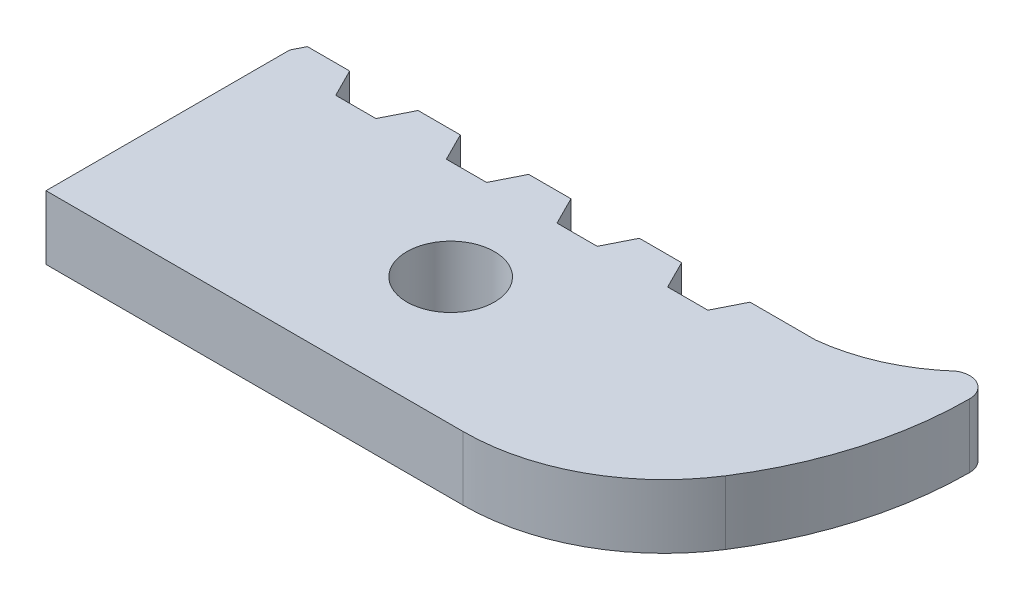
ISO-10303-21;
HEADER;
FILE_DESCRIPTION(('STEP AP214'),'2;1');
FILE_NAME('part.step','',(''),(''),'','','');
FILE_SCHEMA(('AUTOMOTIVE_DESIGN { 1 0 10303 214 1 1 1 1 }'));
ENDSEC;
DATA;
#1=APPLICATION_CONTEXT('core data for automotive mechanical design processes');
#2=APPLICATION_PROTOCOL_DEFINITION('international standard','automotive_design',2000,#1);
#3=PRODUCT_CONTEXT('',#1,'mechanical');
#4=PRODUCT('Part','Part','',(#3));
#5=PRODUCT_RELATED_PRODUCT_CATEGORY('part','',(#4));
#6=PRODUCT_DEFINITION_FORMATION('','',#4);
#7=PRODUCT_DEFINITION_CONTEXT('part definition',#1,'design');
#8=PRODUCT_DEFINITION('design','',#6,#7);
#9=PRODUCT_DEFINITION_SHAPE('','',#8);
#10=(LENGTH_UNIT() NAMED_UNIT(*) SI_UNIT(.MILLI.,.METRE.));
#11=(NAMED_UNIT(*) PLANE_ANGLE_UNIT() SI_UNIT($,.RADIAN.));
#12=(NAMED_UNIT(*) SI_UNIT($,.STERADIAN.) SOLID_ANGLE_UNIT());
#13=UNCERTAINTY_MEASURE_WITH_UNIT(LENGTH_MEASURE(1.E-05),#10,'distance_accuracy_value','');
#14=(GEOMETRIC_REPRESENTATION_CONTEXT(3) GLOBAL_UNCERTAINTY_ASSIGNED_CONTEXT((#13)) GLOBAL_UNIT_ASSIGNED_CONTEXT((#10,
#11,#12)) REPRESENTATION_CONTEXT('',''));
#15=CARTESIAN_POINT('',(0.,0.,0.));
#16=DIRECTION('',(0.,0.,1.));
#17=DIRECTION('',(1.,0.,0.));
#18=AXIS2_PLACEMENT_3D('',#15,#16,#17);
#19=CARTESIAN_POINT('',(-62.8446619217082,3.175,-8.70017793594306));
#20=DIRECTION('',(0.,0.,1.));
#21=DIRECTION('',(1.,0.,0.));
#22=AXIS2_PLACEMENT_3D('',#19,#20,#21);
#23=PLANE('',#22);
#24=DIRECTION('',(-1.,0.,0.));
#25=VECTOR('',#24,1.);
#26=CARTESIAN_POINT('',(-62.8446619217082,0.,-8.70017793594306));
#27=LINE('',#26,#25);
#28=CARTESIAN_POINT('',(-4.31466192170818,0.,-8.70017793594306));
#29=VERTEX_POINT('',#28);
#30=CARTESIAN_POINT('',(-6.41466192170818,0.,-8.70017793594306));
#31=VERTEX_POINT('',#30);
#32=EDGE_CURVE('E321',#29,#31,#27,.T.);
#33=ORIENTED_EDGE('',*,*,#32,.T.);
#34=DIRECTION('',(0.,1.,0.));
#35=VECTOR('',#34,1.);
#36=CARTESIAN_POINT('',(-6.41466192170818,-6.825,-8.70017793594306));
#37=LINE('',#36,#35);
#38=CARTESIAN_POINT('',(-6.41466192170818,3.175,-8.70017793594306));
#39=VERTEX_POINT('',#38);
#40=EDGE_CURVE('E328',#31,#39,#37,.T.);
#41=ORIENTED_EDGE('',*,*,#40,.T.);
#42=DIRECTION('',(-1.,0.,0.));
#43=VECTOR('',#42,1.);
#44=CARTESIAN_POINT('',(-62.8446619217082,3.175,-8.70017793594306));
#45=LINE('',#44,#43);
#46=CARTESIAN_POINT('',(-4.31466192170818,3.175,-8.70017793594306));
#47=VERTEX_POINT('',#46);
#48=EDGE_CURVE('E231',#47,#39,#45,.T.);
#49=ORIENTED_EDGE('',*,*,#48,.F.);
#50=DIRECTION('',(0.,1.,0.));
#51=VECTOR('',#50,1.);
#52=CARTESIAN_POINT('',(-4.31466192170818,-6.825,-8.70017793594306));
#53=LINE('',#52,#51);
#54=EDGE_CURVE('E330',#29,#47,#53,.T.);
#55=ORIENTED_EDGE('',*,*,#54,.F.);
#56=EDGE_LOOP('',(#33,#41,#49,#55));
#57=FACE_BOUND('',#56,.T.);
#58=ADVANCED_FACE('F42',(#57),#23,.F.);
#59=CARTESIAN_POINT('',(1.18533807829182,3.175,-8.70017793594306));
#60=VERTEX_POINT('',#59);
#61=CARTESIAN_POINT('',(-0.914661921708177,3.175,-8.70017793594306));
#62=VERTEX_POINT('',#61);
#63=EDGE_CURVE('E511',#60,#62,#45,.T.);
#64=ORIENTED_EDGE('',*,*,#63,.F.);
#65=DIRECTION('',(0.,1.,0.));
#66=VECTOR('',#65,1.);
#67=CARTESIAN_POINT('',(1.18533807829182,-6.825,-8.70017793594306));
#68=LINE('',#67,#66);
#69=CARTESIAN_POINT('',(1.18533807829182,0.,-8.70017793594306));
#70=VERTEX_POINT('',#69);
#71=EDGE_CURVE('E389',#70,#60,#68,.T.);
#72=ORIENTED_EDGE('',*,*,#71,.F.);
#73=CARTESIAN_POINT('',(-0.914661921708177,0.,-8.70017793594306));
#74=VERTEX_POINT('',#73);
#75=EDGE_CURVE('E332',#70,#74,#27,.T.);
#76=ORIENTED_EDGE('',*,*,#75,.T.);
#77=DIRECTION('',(0.,1.,0.));
#78=VECTOR('',#77,1.);
#79=CARTESIAN_POINT('',(-0.914661921708177,-6.825,-8.70017793594306));
#80=LINE('',#79,#78);
#81=EDGE_CURVE('E415',#74,#62,#80,.T.);
#82=ORIENTED_EDGE('',*,*,#81,.T.);
#83=EDGE_LOOP('',(#64,#72,#76,#82));
#84=FACE_BOUND('',#83,.T.);
#85=ADVANCED_FACE('F532',(#84),#23,.F.);
#86=CARTESIAN_POINT('',(6.68533807829182,0.,-8.70017793594306));
#87=VERTEX_POINT('',#86);
#88=CARTESIAN_POINT('',(4.58533807829182,0.,-8.70017793594306));
#89=VERTEX_POINT('',#88);
#90=EDGE_CURVE('E235',#87,#89,#27,.T.);
#91=ORIENTED_EDGE('',*,*,#90,.T.);
#92=DIRECTION('',(0.,1.,0.));
#93=VECTOR('',#92,1.);
#94=CARTESIAN_POINT('',(4.58533807829182,-6.825,-8.70017793594306));
#95=LINE('',#94,#93);
#96=CARTESIAN_POINT('',(4.58533807829182,3.175,-8.70017793594306));
#97=VERTEX_POINT('',#96);
#98=EDGE_CURVE('E385',#89,#97,#95,.T.);
#99=ORIENTED_EDGE('',*,*,#98,.T.);
#100=CARTESIAN_POINT('',(6.68533807829182,3.175,-8.70017793594306));
#101=VERTEX_POINT('',#100);
#102=EDGE_CURVE('E245',#101,#97,#45,.T.);
#103=ORIENTED_EDGE('',*,*,#102,.F.);
#104=DIRECTION('',(0.,1.,0.));
#105=VECTOR('',#104,1.);
#106=CARTESIAN_POINT('',(6.68533807829182,-6.825,-8.70017793594306));
#107=LINE('',#106,#105);
#108=EDGE_CURVE('E351',#87,#101,#107,.T.);
#109=ORIENTED_EDGE('',*,*,#108,.F.);
#110=EDGE_LOOP('',(#91,#99,#103,#109));
#111=FACE_BOUND('',#110,.T.);
#112=ADVANCED_FACE('F508',(#111),#23,.F.);
#113=CARTESIAN_POINT('',(-9.81466192170818,3.175,-8.70017793594306));
#114=VERTEX_POINT('',#113);
#115=CARTESIAN_POINT('',(-11.9146619217082,3.175,-8.70017793594302));
#116=VERTEX_POINT('',#115);
#117=EDGE_CURVE('E226',#114,#116,#45,.T.);
#118=ORIENTED_EDGE('',*,*,#117,.F.);
#119=DIRECTION('',(0.,1.,0.));
#120=VECTOR('',#119,1.);
#121=CARTESIAN_POINT('',(-9.81466192170818,-6.825,-8.70017793594306));
#122=LINE('',#121,#120);
#123=CARTESIAN_POINT('',(-9.81466192170818,0.,-8.70017793594306));
#124=VERTEX_POINT('',#123);
#125=EDGE_CURVE('E344',#124,#114,#122,.T.);
#126=ORIENTED_EDGE('',*,*,#125,.F.);
#127=CARTESIAN_POINT('',(-11.9146619217082,0.,-8.70017793594302));
#128=VERTEX_POINT('',#127);
#129=EDGE_CURVE('E237',#124,#128,#27,.T.);
#130=ORIENTED_EDGE('',*,*,#129,.T.);
#131=DIRECTION('',(0.,1.,0.));
#132=VECTOR('',#131,1.);
#133=CARTESIAN_POINT('',(-11.9146619217082,-6.825,-8.70017793594302));
#134=LINE('',#133,#132);
#135=EDGE_CURVE('E209',#128,#116,#134,.T.);
#136=ORIENTED_EDGE('',*,*,#135,.T.);
#137=EDGE_LOOP('',(#118,#126,#130,#136));
#138=FACE_BOUND('',#137,.T.);
#139=ADVANCED_FACE('F342',(#138),#23,.F.);
#140=CARTESIAN_POINT('',(-62.8446619217082,3.175,3.99982206405694));
#141=DIRECTION('',(0.,0.,-1.));
#142=DIRECTION('',(-1.,0.,0.));
#143=AXIS2_PLACEMENT_3D('',#140,#141,#142);
#144=PLANE('',#143);
#145=DIRECTION('',(1.,0.,0.));
#146=VECTOR('',#145,1.);
#147=CARTESIAN_POINT('',(-62.8446619217082,3.175,3.99982206405694));
#148=LINE('',#147,#146);
#149=CARTESIAN_POINT('',(-12.2094719217082,3.175,3.99982206405694));
#150=VERTEX_POINT('',#149);
#151=CARTESIAN_POINT('',(8.52538626919086,3.175,3.99982206405694));
#152=VERTEX_POINT('',#151);
#153=EDGE_CURVE('E215',#150,#152,#148,.T.);
#154=ORIENTED_EDGE('',*,*,#153,.F.);
#155=DIRECTION('',(0.,-1.,0.));
#156=VECTOR('',#155,1.);
#157=CARTESIAN_POINT('',(-12.2094719217082,3.175,3.99982206405694));
#158=LINE('',#157,#156);
#159=CARTESIAN_POINT('',(-12.2094719217082,0.,3.99982206405694));
#160=VERTEX_POINT('',#159);
#161=EDGE_CURVE('E201',#150,#160,#158,.T.);
#162=ORIENTED_EDGE('',*,*,#161,.T.);
#163=DIRECTION('',(1.,0.,0.));
#164=VECTOR('',#163,1.);
#165=CARTESIAN_POINT('',(-62.8446619217082,0.,3.99982206405694));
#166=LINE('',#165,#164);
#167=CARTESIAN_POINT('',(8.52538626919086,0.,3.99982206405694));
#168=VERTEX_POINT('',#167);
#169=EDGE_CURVE('E246',#160,#168,#166,.T.);
#170=ORIENTED_EDGE('',*,*,#169,.T.);
#171=DIRECTION('',(0.,1.,0.));
#172=VECTOR('',#171,1.);
#173=CARTESIAN_POINT('',(8.52538626919086,3.175,3.99982206405694));
#174=LINE('',#173,#172);
#175=EDGE_CURVE('E224',#168,#152,#174,.T.);
#176=ORIENTED_EDGE('',*,*,#175,.T.);
#177=EDGE_LOOP('',(#154,#162,#170,#176));
#178=FACE_BOUND('',#177,.T.);
#179=ADVANCED_FACE('F222',(#178),#144,.F.);
#180=CARTESIAN_POINT('',(13.3553380782918,0.,-8.70017793594306));
#181=VERTEX_POINT('',#180);
#182=CARTESIAN_POINT('',(10.0853380782918,0.,-8.70017793594306));
#183=VERTEX_POINT('',#182);
#184=EDGE_CURVE('E227',#181,#183,#27,.T.);
#185=ORIENTED_EDGE('',*,*,#184,.T.);
#186=DIRECTION('',(0.,1.,0.));
#187=VECTOR('',#186,1.);
#188=CARTESIAN_POINT('',(10.0853380782918,-6.825,-8.70017793594306));
#189=LINE('',#188,#187);
#190=CARTESIAN_POINT('',(10.0853380782918,3.175,-8.70017793594306));
#191=VERTEX_POINT('',#190);
#192=EDGE_CURVE('E470',#183,#191,#189,.T.);
#193=ORIENTED_EDGE('',*,*,#192,.T.);
#194=CARTESIAN_POINT('',(13.3553380782918,3.175,-8.70017793594306));
#195=VERTEX_POINT('',#194);
#196=EDGE_CURVE('E233',#195,#191,#45,.T.);
#197=ORIENTED_EDGE('',*,*,#196,.F.);
#198=DIRECTION('',(0.,-1.,0.));
#199=VECTOR('',#198,1.);
#200=CARTESIAN_POINT('',(13.3553380782918,3.175,-8.70017793594306));
#201=LINE('',#200,#199);
#202=EDGE_CURVE('E244',#195,#181,#201,.T.);
#203=ORIENTED_EDGE('',*,*,#202,.T.);
#204=EDGE_LOOP('',(#185,#193,#197,#203));
#205=FACE_BOUND('',#204,.T.);
#206=ADVANCED_FACE('F468',(#205),#23,.F.);
#207=CARTESIAN_POINT('',(-62.8446619217082,3.175,-2.35017793594306));
#208=DIRECTION('',(0.,1.,0.));
#209=DIRECTION('',(0.,0.,1.));
#210=AXIS2_PLACEMENT_3D('',#207,#208,#209);
#211=PLANE('',#210);
#212=DIRECTION('',(0.,0.,-1.));
#213=VECTOR('',#212,1.);
#214=CARTESIAN_POINT('',(-12.2094719217082,3.175,-15.0501779359431));
#215=LINE('',#214,#213);
#216=CARTESIAN_POINT('',(-12.2094719217082,3.175,-8.11302989529168));
#217=VERTEX_POINT('',#216);
#218=EDGE_CURVE('E58',#150,#217,#215,.T.);
#219=ORIENTED_EDGE('',*,*,#218,.F.);
#220=ORIENTED_EDGE('',*,*,#153,.T.);
#221=CARTESIAN_POINT('',(8.52538626919086,3.175,-6.00017793594306));
#222=DIRECTION('',(0.,1.,0.));
#223=DIRECTION('',(0.,0.,1.));
#224=AXIS2_PLACEMENT_3D('',#221,#222,#223);
#225=CIRCLE('',#224,10.);
#226=CARTESIAN_POINT('',(16.9520591465912,3.175,-0.615831715900555));
#227=VERTEX_POINT('',#226);
#228=EDGE_CURVE('E258',#152,#227,#225,.T.);
#229=ORIENTED_EDGE('',*,*,#228,.T.);
#230=CARTESIAN_POINT('',(2.20538161114063,3.175,-10.0384376009749));
#231=DIRECTION('',(0.,-1.,0.));
#232=DIRECTION('',(0.,0.,-1.));
#233=AXIS2_PLACEMENT_3D('',#230,#231,#232);
#234=CIRCLE('',#233,17.5);
#235=CARTESIAN_POINT('',(19.7053380782918,3.175,-9.99940366940698));
#236=VERTEX_POINT('',#235);
#237=EDGE_CURVE('E414',#236,#227,#234,.T.);
#238=ORIENTED_EDGE('',*,*,#237,.F.);
#239=CARTESIAN_POINT('',(18.7053380782918,3.175,-9.99940366940698));
#240=DIRECTION('',(0.,1.,0.));
#241=DIRECTION('',(0.,0.,1.));
#242=AXIS2_PLACEMENT_3D('',#239,#240,#241);
#243=CIRCLE('',#242,0.999999999999984);
#244=CARTESIAN_POINT('',(18.1740880782918,3.175,-10.8466187763899));
#245=VERTEX_POINT('',#244);
#246=EDGE_CURVE('E431',#236,#245,#243,.T.);
#247=ORIENTED_EDGE('',*,*,#246,.T.);
#248=CARTESIAN_POINT('',(12.3699968037474,3.175,-17.3945210722978));
#249=DIRECTION('',(0.,-1.,0.));
#250=DIRECTION('',(0.,0.,-1.));
#251=AXIS2_PLACEMENT_3D('',#248,#249,#250);
#252=CIRCLE('',#251,8.75);
#253=EDGE_CURVE('E437',#245,#195,#252,.T.);
#254=ORIENTED_EDGE('',*,*,#253,.T.);
#255=ORIENTED_EDGE('',*,*,#196,.T.);
#256=DIRECTION('',(0.448717948717949,0.,-0.893673431684279));
#257=VECTOR('',#256,1.);
#258=CARTESIAN_POINT('',(9.38533807829182,3.175,-7.30604738251558));
#259=LINE('',#258,#257);
#260=CARTESIAN_POINT('',(9.38533807829182,3.175,-7.30604738251558));
#261=VERTEX_POINT('',#260);
#262=EDGE_CURVE('E473',#261,#191,#259,.T.);
#263=ORIENTED_EDGE('',*,*,#262,.F.);
#264=DIRECTION('',(1.,0.,0.));
#265=VECTOR('',#264,1.);
#266=CARTESIAN_POINT('',(7.38533807829182,3.175,-7.30604738251558));
#267=LINE('',#266,#265);
#268=CARTESIAN_POINT('',(7.38533807829182,3.175,-7.30604738251558));
#269=VERTEX_POINT('',#268);
#270=EDGE_CURVE('E476',#269,#261,#267,.T.);
#271=ORIENTED_EDGE('',*,*,#270,.F.);
#272=DIRECTION('',(0.44871794871795,0.,0.893673431684279));
#273=VECTOR('',#272,1.);
#274=CARTESIAN_POINT('',(6.68533807829182,3.175,-8.70017793594306));
#275=LINE('',#274,#273);
#276=EDGE_CURVE('E354',#101,#269,#275,.T.);
#277=ORIENTED_EDGE('',*,*,#276,.F.);
#278=ORIENTED_EDGE('',*,*,#102,.T.);
#279=DIRECTION('',(0.448717948717949,0.,-0.893673431684279));
#280=VECTOR('',#279,1.);
#281=CARTESIAN_POINT('',(3.88533807829182,3.175,-7.30604738251558));
#282=LINE('',#281,#280);
#283=CARTESIAN_POINT('',(3.88533807829182,3.175,-7.30604738251558));
#284=VERTEX_POINT('',#283);
#285=EDGE_CURVE('E381',#284,#97,#282,.T.);
#286=ORIENTED_EDGE('',*,*,#285,.F.);
#287=DIRECTION('',(1.,0.,0.));
#288=VECTOR('',#287,1.);
#289=CARTESIAN_POINT('',(1.88533807829182,3.175,-7.30604738251558));
#290=LINE('',#289,#288);
#291=CARTESIAN_POINT('',(1.88533807829182,3.175,-7.30604738251558));
#292=VERTEX_POINT('',#291);
#293=EDGE_CURVE('E394',#292,#284,#290,.T.);
#294=ORIENTED_EDGE('',*,*,#293,.F.);
#295=DIRECTION('',(0.44871794871795,0.,0.893673431684279));
#296=VECTOR('',#295,1.);
#297=CARTESIAN_POINT('',(1.18533807829182,3.175,-8.70017793594306));
#298=LINE('',#297,#296);
#299=EDGE_CURVE('E367',#60,#292,#298,.T.);
#300=ORIENTED_EDGE('',*,*,#299,.F.);
#301=ORIENTED_EDGE('',*,*,#63,.T.);
#302=DIRECTION('',(0.448717948717949,0.,-0.893673431684279));
#303=VECTOR('',#302,1.);
#304=CARTESIAN_POINT('',(-1.61466192170818,3.175,-7.30604738251558));
#305=LINE('',#304,#303);
#306=CARTESIAN_POINT('',(-1.61466192170818,3.175,-7.30604738251558));
#307=VERTEX_POINT('',#306);
#308=EDGE_CURVE('E408',#307,#62,#305,.T.);
#309=ORIENTED_EDGE('',*,*,#308,.F.);
#310=DIRECTION('',(1.,0.,0.));
#311=VECTOR('',#310,1.);
#312=CARTESIAN_POINT('',(-3.61466192170818,3.175,-7.30604738251558));
#313=LINE('',#312,#311);
#314=CARTESIAN_POINT('',(-3.61466192170818,3.175,-7.30604738251558));
#315=VERTEX_POINT('',#314);
#316=EDGE_CURVE('E404',#315,#307,#313,.T.);
#317=ORIENTED_EDGE('',*,*,#316,.F.);
#318=DIRECTION('',(0.44871794871795,0.,0.893673431684279));
#319=VECTOR('',#318,1.);
#320=CARTESIAN_POINT('',(-4.31466192170818,3.175,-8.70017793594306));
#321=LINE('',#320,#319);
#322=EDGE_CURVE('E377',#47,#315,#321,.T.);
#323=ORIENTED_EDGE('',*,*,#322,.F.);
#324=ORIENTED_EDGE('',*,*,#48,.T.);
#325=DIRECTION('',(0.448717948717949,0.,-0.893673431684279));
#326=VECTOR('',#325,1.);
#327=CARTESIAN_POINT('',(-7.11466192170818,3.175,-7.30604738251558));
#328=LINE('',#327,#326);
#329=CARTESIAN_POINT('',(-7.11466192170818,3.175,-7.30604738251558));
#330=VERTEX_POINT('',#329);
#331=EDGE_CURVE('E359',#330,#39,#328,.T.);
#332=ORIENTED_EDGE('',*,*,#331,.F.);
#333=DIRECTION('',(1.,0.,0.));
#334=VECTOR('',#333,1.);
#335=CARTESIAN_POINT('',(-9.11466192170818,3.175,-7.30604738251558));
#336=LINE('',#335,#334);
#337=CARTESIAN_POINT('',(-9.11466192170818,3.175,-7.30604738251558));
#338=VERTEX_POINT('',#337);
#339=EDGE_CURVE('E370',#338,#330,#336,.T.);
#340=ORIENTED_EDGE('',*,*,#339,.F.);
#341=DIRECTION('',(0.44871794871795,0.,0.893673431684279));
#342=VECTOR('',#341,1.);
#343=CARTESIAN_POINT('',(-9.81466192170818,3.175,-8.70017793594306));
#344=LINE('',#343,#342);
#345=EDGE_CURVE('E374',#114,#338,#344,.T.);
#346=ORIENTED_EDGE('',*,*,#345,.F.);
#347=ORIENTED_EDGE('',*,*,#117,.T.);
#348=DIRECTION('',(0.448717948717949,0.,-0.893673431684279));
#349=VECTOR('',#348,1.);
#350=CARTESIAN_POINT('',(-12.6146619217082,3.175,-7.30604738251555));
#351=LINE('',#350,#349);
#352=EDGE_CURVE('E218',#217,#116,#351,.T.);
#353=ORIENTED_EDGE('',*,*,#352,.F.);
#354=EDGE_LOOP('',(#219,#220,#229,#238,#247,#254,#255,#263,#271,#277,#278,#286,#294,#300,#301,
#309,#317,#323,#324,#332,#340,#346,#347,#353));
#355=FACE_BOUND('',#354,.T.);
#356=CARTESIAN_POINT('',(1.55533807829182,3.175,-2.35017793594306));
#357=DIRECTION('',(0.,1.,0.));
#358=DIRECTION('',(0.,0.,1.));
#359=AXIS2_PLACEMENT_3D('',#356,#357,#358);
#360=CIRCLE('',#359,2.175);
#361=CARTESIAN_POINT('',(1.55533807829182,3.175,-0.175177935943059));
#362=VERTEX_POINT('',#361);
#363=EDGE_CURVE('E239',#362,#362,#360,.T.);
#364=ORIENTED_EDGE('',*,*,#363,.F.);
#365=EDGE_LOOP('',(#364));
#366=FACE_BOUND('',#365,.T.);
#367=ADVANCED_FACE('F213',(#355,#366),#211,.T.);
#368=CARTESIAN_POINT('',(-62.8446619217082,0.,-2.35017793594306));
#369=DIRECTION('',(0.,1.,0.));
#370=DIRECTION('',(0.,0.,1.));
#371=AXIS2_PLACEMENT_3D('',#368,#369,#370);
#372=PLANE('',#371);
#373=ORIENTED_EDGE('',*,*,#169,.F.);
#374=DIRECTION('',(0.,0.,-1.));
#375=VECTOR('',#374,1.);
#376=CARTESIAN_POINT('',(-12.2094719217082,0.,-15.0501779359431));
#377=LINE('',#376,#375);
#378=CARTESIAN_POINT('',(-12.2094719217082,0.,-8.11302989529169));
#379=VERTEX_POINT('',#378);
#380=EDGE_CURVE('E204',#160,#379,#377,.T.);
#381=ORIENTED_EDGE('',*,*,#380,.T.);
#382=DIRECTION('',(0.448717948717949,0.,-0.893673431684279));
#383=VECTOR('',#382,1.);
#384=CARTESIAN_POINT('',(-24.7157016611827,0.,16.7945658018294));
#385=LINE('',#384,#383);
#386=EDGE_CURVE('E280',#379,#128,#385,.T.);
#387=ORIENTED_EDGE('',*,*,#386,.T.);
#388=ORIENTED_EDGE('',*,*,#129,.F.);
#389=DIRECTION('',(0.44871794871795,0.,0.893673431684279));
#390=VECTOR('',#389,1.);
#391=CARTESIAN_POINT('',(-17.9457392105046,0.,-24.8941540510735));
#392=LINE('',#391,#390);
#393=CARTESIAN_POINT('',(-9.11466192170819,0.,-7.30604738251558));
#394=VERTEX_POINT('',#393);
#395=EDGE_CURVE('E307',#124,#394,#392,.T.);
#396=ORIENTED_EDGE('',*,*,#395,.T.);
#397=DIRECTION('',(1.,0.,0.));
#398=VECTOR('',#397,1.);
#399=CARTESIAN_POINT('',(-62.8446619217082,0.,-7.30604738251556));
#400=LINE('',#399,#398);
#401=CARTESIAN_POINT('',(-7.11466192170818,0.,-7.30604738251558));
#402=VERTEX_POINT('',#401);
#403=EDGE_CURVE('E311',#394,#402,#400,.T.);
#404=ORIENTED_EDGE('',*,*,#403,.T.);
#405=DIRECTION('',(0.448717948717949,0.,-0.893673431684279));
#406=VECTOR('',#405,1.);
#407=CARTESIAN_POINT('',(-20.3231145474417,0.,19.0001060018194));
#408=LINE('',#407,#406);
#409=EDGE_CURVE('E51',#402,#31,#408,.T.);
#410=ORIENTED_EDGE('',*,*,#409,.T.);
#411=ORIENTED_EDGE('',*,*,#32,.F.);
#412=DIRECTION('',(0.44871794871795,0.,0.893673431684279));
#413=VECTOR('',#412,1.);
#414=CARTESIAN_POINT('',(-13.5531520967637,0.,-27.0996942510636));
#415=LINE('',#414,#413);
#416=CARTESIAN_POINT('',(-3.61466192170818,0.,-7.30604738251558));
#417=VERTEX_POINT('',#416);
#418=EDGE_CURVE('E276',#29,#417,#415,.T.);
#419=ORIENTED_EDGE('',*,*,#418,.T.);
#420=DIRECTION('',(1.,0.,0.));
#421=VECTOR('',#420,1.);
#422=CARTESIAN_POINT('',(-62.8446619217082,0.,-7.30604738251556));
#423=LINE('',#422,#421);
#424=CARTESIAN_POINT('',(-1.61466192170818,0.,-7.30604738251558));
#425=VERTEX_POINT('',#424);
#426=EDGE_CURVE('E268',#417,#425,#423,.T.);
#427=ORIENTED_EDGE('',*,*,#426,.T.);
#428=DIRECTION('',(0.448717948717949,0.,-0.893673431684279));
#429=VECTOR('',#428,1.);
#430=CARTESIAN_POINT('',(-15.9305274337008,0.,21.2056462018095));
#431=LINE('',#430,#429);
#432=EDGE_CURVE('E272',#425,#74,#431,.T.);
#433=ORIENTED_EDGE('',*,*,#432,.T.);
#434=ORIENTED_EDGE('',*,*,#75,.F.);
#435=DIRECTION('',(0.44871794871795,0.,0.893673431684279));
#436=VECTOR('',#435,1.);
#437=CARTESIAN_POINT('',(-9.1605649830227,0.,-29.3052344510536));
#438=LINE('',#437,#436);
#439=CARTESIAN_POINT('',(1.88533807829182,0.,-7.30604738251558));
#440=VERTEX_POINT('',#439);
#441=EDGE_CURVE('E303',#70,#440,#438,.T.);
#442=ORIENTED_EDGE('',*,*,#441,.T.);
#443=DIRECTION('',(1.,0.,0.));
#444=VECTOR('',#443,1.);
#445=CARTESIAN_POINT('',(-62.8446619217082,0.,-7.30604738251556));
#446=LINE('',#445,#444);
#447=CARTESIAN_POINT('',(3.88533807829182,0.,-7.30604738251558));
#448=VERTEX_POINT('',#447);
#449=EDGE_CURVE('E295',#440,#448,#446,.T.);
#450=ORIENTED_EDGE('',*,*,#449,.T.);
#451=DIRECTION('',(0.448717948717949,0.,-0.893673431684279));
#452=VECTOR('',#451,1.);
#453=CARTESIAN_POINT('',(-11.5379403199598,0.,23.4111864017995));
#454=LINE('',#453,#452);
#455=EDGE_CURVE('E299',#448,#89,#454,.T.);
#456=ORIENTED_EDGE('',*,*,#455,.T.);
#457=ORIENTED_EDGE('',*,*,#90,.F.);
#458=DIRECTION('',(0.44871794871795,0.,0.893673431684279));
#459=VECTOR('',#458,1.);
#460=CARTESIAN_POINT('',(-4.76797786928176,0.,-31.5107746510437));
#461=LINE('',#460,#459);
#462=CARTESIAN_POINT('',(7.38533807829182,0.,-7.30604738251558));
#463=VERTEX_POINT('',#462);
#464=EDGE_CURVE('E291',#87,#463,#461,.T.);
#465=ORIENTED_EDGE('',*,*,#464,.T.);
#466=DIRECTION('',(1.,0.,0.));
#467=VECTOR('',#466,1.);
#468=CARTESIAN_POINT('',(-62.8446619217082,0.,-7.30604738251555));
#469=LINE('',#468,#467);
#470=CARTESIAN_POINT('',(9.38533807829182,0.,-7.30604738251558));
#471=VERTEX_POINT('',#470);
#472=EDGE_CURVE('E283',#463,#471,#469,.T.);
#473=ORIENTED_EDGE('',*,*,#472,.T.);
#474=DIRECTION('',(0.448717948717949,0.,-0.893673431684279));
#475=VECTOR('',#474,1.);
#476=CARTESIAN_POINT('',(-7.14535320621887,0.,25.6167266017896));
#477=LINE('',#476,#475);
#478=EDGE_CURVE('E287',#471,#183,#477,.T.);
#479=ORIENTED_EDGE('',*,*,#478,.T.);
#480=ORIENTED_EDGE('',*,*,#184,.F.);
#481=CARTESIAN_POINT('',(12.3699968037474,0.,-17.3945210722978));
#482=DIRECTION('',(0.,-1.,0.));
#483=DIRECTION('',(0.,0.,-1.));
#484=AXIS2_PLACEMENT_3D('',#481,#482,#483);
#485=CIRCLE('',#484,8.75);
#486=CARTESIAN_POINT('',(18.1740880782918,0.,-10.8466187763899));
#487=VERTEX_POINT('',#486);
#488=EDGE_CURVE('E436',#487,#181,#485,.T.);
#489=ORIENTED_EDGE('',*,*,#488,.F.);
#490=CARTESIAN_POINT('',(18.7053380782918,0.,-9.99940366940698));
#491=DIRECTION('',(0.,1.,0.));
#492=DIRECTION('',(0.,0.,1.));
#493=AXIS2_PLACEMENT_3D('',#490,#491,#492);
#494=CIRCLE('',#493,0.999999999999984);
#495=CARTESIAN_POINT('',(19.7053380782918,0.,-9.99940366940698));
#496=VERTEX_POINT('',#495);
#497=EDGE_CURVE('E432',#496,#487,#494,.T.);
#498=ORIENTED_EDGE('',*,*,#497,.F.);
#499=CARTESIAN_POINT('',(2.20538161114063,0.,-10.0384376009749));
#500=DIRECTION('',(0.,1.,0.));
#501=DIRECTION('',(0.,0.,1.));
#502=AXIS2_PLACEMENT_3D('',#499,#500,#501);
#503=CIRCLE('',#502,17.5);
#504=CARTESIAN_POINT('',(16.9520591465912,0.,-0.615831715900555));
#505=VERTEX_POINT('',#504);
#506=EDGE_CURVE('E427',#496,#505,#503,.F.);
#507=ORIENTED_EDGE('',*,*,#506,.T.);
#508=CARTESIAN_POINT('',(8.52538626919086,0.,-6.00017793594306));
#509=DIRECTION('',(0.,1.,0.));
#510=DIRECTION('',(0.,0.,1.));
#511=AXIS2_PLACEMENT_3D('',#508,#509,#510);
#512=CIRCLE('',#511,10.);
#513=EDGE_CURVE('E264',#505,#168,#512,.F.);
#514=ORIENTED_EDGE('',*,*,#513,.T.);
#515=EDGE_LOOP('',(#373,#381,#387,#388,#396,#404,#410,#411,#419,#427,#433,#434,#442,#450,#456,
#457,#465,#473,#479,#480,#489,#498,#507,#514));
#516=FACE_BOUND('',#515,.T.);
#517=CARTESIAN_POINT('',(1.55533807829182,0.,-2.35017793594306));
#518=DIRECTION('',(0.,1.,0.));
#519=DIRECTION('',(0.,0.,1.));
#520=AXIS2_PLACEMENT_3D('',#517,#518,#519);
#521=CIRCLE('',#520,2.175);
#522=CARTESIAN_POINT('',(1.55533807829182,0.,-0.175177935943059));
#523=VERTEX_POINT('',#522);
#524=EDGE_CURVE('E248',#523,#523,#521,.T.);
#525=ORIENTED_EDGE('',*,*,#524,.T.);
#526=EDGE_LOOP('',(#525));
#527=FACE_BOUND('',#526,.T.);
#528=ADVANCED_FACE('F319',(#516,#527),#372,.F.);
#529=CARTESIAN_POINT('',(1.55533807829182,-3.175,-2.35017793594306));
#530=DIRECTION('',(0.,1.,0.));
#531=DIRECTION('',(0.,0.,1.));
#532=AXIS2_PLACEMENT_3D('',#529,#530,#531);
#533=CYLINDRICAL_SURFACE('',#532,2.175);
#534=ORIENTED_EDGE('',*,*,#363,.T.);
#535=EDGE_LOOP('',(#534));
#536=FACE_BOUND('',#535,.T.);
#537=ORIENTED_EDGE('',*,*,#524,.F.);
#538=EDGE_LOOP('',(#537));
#539=FACE_BOUND('',#538,.T.);
#540=ADVANCED_FACE('F614',(#536,#539),#533,.F.);
#541=CARTESIAN_POINT('',(18.7053380782918,0.,-9.99940366940698));
#542=DIRECTION('',(0.,1.,0.));
#543=DIRECTION('',(0.,0.,1.));
#544=AXIS2_PLACEMENT_3D('',#541,#542,#543);
#545=CYLINDRICAL_SURFACE('',#544,0.999999999999984);
#546=ORIENTED_EDGE('',*,*,#246,.F.);
#547=DIRECTION('',(0.,1.,0.));
#548=VECTOR('',#547,1.);
#549=CARTESIAN_POINT('',(19.7053380782918,0.,-9.99940366940698));
#550=LINE('',#549,#548);
#551=EDGE_CURVE('E447',#496,#236,#550,.T.);
#552=ORIENTED_EDGE('',*,*,#551,.F.);
#553=ORIENTED_EDGE('',*,*,#497,.T.);
#554=DIRECTION('',(0.,1.,0.));
#555=VECTOR('',#554,1.);
#556=CARTESIAN_POINT('',(18.1740880782918,0.,-10.8466187763899));
#557=LINE('',#556,#555);
#558=EDGE_CURVE('E440',#487,#245,#557,.T.);
#559=ORIENTED_EDGE('',*,*,#558,.T.);
#560=EDGE_LOOP('',(#546,#552,#553,#559));
#561=FACE_BOUND('',#560,.T.);
#562=ADVANCED_FACE('F453',(#561),#545,.T.);
#563=CARTESIAN_POINT('',(12.3699968037474,0.,-17.3945210722978));
#564=DIRECTION('',(0.,1.,0.));
#565=DIRECTION('',(0.,0.,1.));
#566=AXIS2_PLACEMENT_3D('',#563,#564,#565);
#567=CYLINDRICAL_SURFACE('',#566,8.75);
#568=ORIENTED_EDGE('',*,*,#253,.F.);
#569=ORIENTED_EDGE('',*,*,#558,.F.);
#570=ORIENTED_EDGE('',*,*,#488,.T.);
#571=ORIENTED_EDGE('',*,*,#202,.F.);
#572=EDGE_LOOP('',(#568,#569,#570,#571));
#573=FACE_BOUND('',#572,.T.);
#574=ADVANCED_FACE('F458',(#573),#567,.F.);
#575=CARTESIAN_POINT('',(2.20538161114063,-6.825,-10.0384376009749));
#576=DIRECTION('',(0.,1.,0.));
#577=DIRECTION('',(0.,0.,1.));
#578=AXIS2_PLACEMENT_3D('',#575,#576,#577);
#579=CYLINDRICAL_SURFACE('',#578,17.5);
#580=ORIENTED_EDGE('',*,*,#237,.T.);
#581=DIRECTION('',(0.,1.,0.));
#582=VECTOR('',#581,1.);
#583=CARTESIAN_POINT('',(16.9520591465912,-6.825,-0.615831715900557));
#584=LINE('',#583,#582);
#585=EDGE_CURVE('E261',#227,#505,#584,.F.);
#586=ORIENTED_EDGE('',*,*,#585,.T.);
#587=ORIENTED_EDGE('',*,*,#506,.F.);
#588=ORIENTED_EDGE('',*,*,#551,.T.);
#589=EDGE_LOOP('',(#580,#586,#587,#588));
#590=FACE_BOUND('',#589,.T.);
#591=ADVANCED_FACE('F463',(#590),#579,.T.);
#592=CARTESIAN_POINT('',(8.52538626919086,-6.825,-6.00017793594306));
#593=DIRECTION('',(0.,1.,0.));
#594=DIRECTION('',(0.,0.,1.));
#595=AXIS2_PLACEMENT_3D('',#592,#593,#594);
#596=CYLINDRICAL_SURFACE('',#595,10.);
#597=ORIENTED_EDGE('',*,*,#513,.F.);
#598=ORIENTED_EDGE('',*,*,#585,.F.);
#599=ORIENTED_EDGE('',*,*,#228,.F.);
#600=ORIENTED_EDGE('',*,*,#175,.F.);
#601=EDGE_LOOP('',(#597,#598,#599,#600));
#602=FACE_BOUND('',#601,.T.);
#603=ADVANCED_FACE('F44',(#602),#596,.T.);
#604=CARTESIAN_POINT('',(-4.31466192170818,-6.825,-8.70017793594306));
#605=DIRECTION('',(-0.893673431684279,0.,0.44871794871795));
#606=DIRECTION('',(0.44871794871795,0.,0.893673431684279));
#607=AXIS2_PLACEMENT_3D('',#604,#605,#606);
#608=PLANE('',#607);
#609=ORIENTED_EDGE('',*,*,#54,.T.);
#610=ORIENTED_EDGE('',*,*,#322,.T.);
#611=DIRECTION('',(0.,1.,0.));
#612=VECTOR('',#611,1.);
#613=CARTESIAN_POINT('',(-3.61466192170818,-6.825,-7.30604738251558));
#614=LINE('',#613,#612);
#615=EDGE_CURVE('E411',#417,#315,#614,.T.);
#616=ORIENTED_EDGE('',*,*,#615,.F.);
#617=ORIENTED_EDGE('',*,*,#418,.F.);
#618=EDGE_LOOP('',(#609,#610,#616,#617));
#619=FACE_BOUND('',#618,.T.);
#620=ADVANCED_FACE('F524',(#619),#608,.F.);
#621=CARTESIAN_POINT('',(-1.61466192170818,-6.825,-7.30604738251558));
#622=DIRECTION('',(0.893673431684279,0.,0.448717948717949));
#623=DIRECTION('',(0.448717948717949,0.,-0.893673431684279));
#624=AXIS2_PLACEMENT_3D('',#621,#622,#623);
#625=PLANE('',#624);
#626=DIRECTION('',(0.,1.,0.));
#627=VECTOR('',#626,1.);
#628=CARTESIAN_POINT('',(-1.61466192170818,-6.825,-7.30604738251558));
#629=LINE('',#628,#627);
#630=EDGE_CURVE('E419',#425,#307,#629,.T.);
#631=ORIENTED_EDGE('',*,*,#630,.T.);
#632=ORIENTED_EDGE('',*,*,#308,.T.);
#633=ORIENTED_EDGE('',*,*,#81,.F.);
#634=ORIENTED_EDGE('',*,*,#432,.F.);
#635=EDGE_LOOP('',(#631,#632,#633,#634));
#636=FACE_BOUND('',#635,.T.);
#637=ADVANCED_FACE('F530',(#636),#625,.F.);
#638=CARTESIAN_POINT('',(-3.61466192170818,-6.825,-7.30604738251558));
#639=DIRECTION('',(0.,0.,1.));
#640=DIRECTION('',(1.,0.,0.));
#641=AXIS2_PLACEMENT_3D('',#638,#639,#640);
#642=PLANE('',#641);
#643=ORIENTED_EDGE('',*,*,#615,.T.);
#644=ORIENTED_EDGE('',*,*,#316,.T.);
#645=ORIENTED_EDGE('',*,*,#630,.F.);
#646=ORIENTED_EDGE('',*,*,#426,.F.);
#647=EDGE_LOOP('',(#643,#644,#645,#646));
#648=FACE_BOUND('',#647,.T.);
#649=ADVANCED_FACE('F528',(#648),#642,.F.);
#650=CARTESIAN_POINT('',(-12.6146619217082,-6.825,-7.30604738251555));
#651=DIRECTION('',(0.893673431684279,0.,0.448717948717949));
#652=DIRECTION('',(0.448717948717949,0.,-0.893673431684279));
#653=AXIS2_PLACEMENT_3D('',#650,#651,#652);
#654=PLANE('',#653);
#655=ORIENTED_EDGE('',*,*,#386,.F.);
#656=DIRECTION('',(0.,1.,0.));
#657=VECTOR('',#656,1.);
#658=CARTESIAN_POINT('',(-12.2094719217082,-6.825,-8.11302989529168));
#659=LINE('',#658,#657);
#660=EDGE_CURVE('E11',#379,#217,#659,.T.);
#661=ORIENTED_EDGE('',*,*,#660,.T.);
#662=ORIENTED_EDGE('',*,*,#352,.T.);
#663=ORIENTED_EDGE('',*,*,#135,.F.);
#664=EDGE_LOOP('',(#655,#661,#662,#663));
#665=FACE_BOUND('',#664,.T.);
#666=ADVANCED_FACE('F347',(#665),#654,.F.);
#667=CARTESIAN_POINT('',(6.68533807829182,-6.825,-8.70017793594306));
#668=DIRECTION('',(-0.893673431684279,0.,0.44871794871795));
#669=DIRECTION('',(0.44871794871795,0.,0.893673431684279));
#670=AXIS2_PLACEMENT_3D('',#667,#668,#669);
#671=PLANE('',#670);
#672=ORIENTED_EDGE('',*,*,#108,.T.);
#673=ORIENTED_EDGE('',*,*,#276,.T.);
#674=DIRECTION('',(0.,1.,0.));
#675=VECTOR('',#674,1.);
#676=CARTESIAN_POINT('',(7.38533807829182,-6.825,-7.30604738251558));
#677=LINE('',#676,#675);
#678=EDGE_CURVE('E479',#463,#269,#677,.T.);
#679=ORIENTED_EDGE('',*,*,#678,.F.);
#680=ORIENTED_EDGE('',*,*,#464,.F.);
#681=EDGE_LOOP('',(#672,#673,#679,#680));
#682=FACE_BOUND('',#681,.T.);
#683=ADVANCED_FACE('F500',(#682),#671,.F.);
#684=CARTESIAN_POINT('',(9.38533807829182,-6.825,-7.30604738251558));
#685=DIRECTION('',(0.893673431684279,0.,0.448717948717949));
#686=DIRECTION('',(0.448717948717949,0.,-0.893673431684279));
#687=AXIS2_PLACEMENT_3D('',#684,#685,#686);
#688=PLANE('',#687);
#689=DIRECTION('',(0.,1.,0.));
#690=VECTOR('',#689,1.);
#691=CARTESIAN_POINT('',(9.38533807829182,-6.825,-7.30604738251558));
#692=LINE('',#691,#690);
#693=EDGE_CURVE('E483',#471,#261,#692,.T.);
#694=ORIENTED_EDGE('',*,*,#693,.T.);
#695=ORIENTED_EDGE('',*,*,#262,.T.);
#696=ORIENTED_EDGE('',*,*,#192,.F.);
#697=ORIENTED_EDGE('',*,*,#478,.F.);
#698=EDGE_LOOP('',(#694,#695,#696,#697));
#699=FACE_BOUND('',#698,.T.);
#700=ADVANCED_FACE('F494',(#699),#688,.F.);
#701=CARTESIAN_POINT('',(7.38533807829182,-6.825,-7.30604738251558));
#702=DIRECTION('',(0.,0.,1.));
#703=DIRECTION('',(1.,0.,0.));
#704=AXIS2_PLACEMENT_3D('',#701,#702,#703);
#705=PLANE('',#704);
#706=ORIENTED_EDGE('',*,*,#678,.T.);
#707=ORIENTED_EDGE('',*,*,#270,.T.);
#708=ORIENTED_EDGE('',*,*,#693,.F.);
#709=ORIENTED_EDGE('',*,*,#472,.F.);
#710=EDGE_LOOP('',(#706,#707,#708,#709));
#711=FACE_BOUND('',#710,.T.);
#712=ADVANCED_FACE('F496',(#711),#705,.F.);
#713=CARTESIAN_POINT('',(1.18533807829182,-6.825,-8.70017793594306));
#714=DIRECTION('',(-0.893673431684279,0.,0.44871794871795));
#715=DIRECTION('',(0.44871794871795,0.,0.893673431684279));
#716=AXIS2_PLACEMENT_3D('',#713,#714,#715);
#717=PLANE('',#716);
#718=ORIENTED_EDGE('',*,*,#71,.T.);
#719=ORIENTED_EDGE('',*,*,#299,.T.);
#720=DIRECTION('',(0.,1.,0.));
#721=VECTOR('',#720,1.);
#722=CARTESIAN_POINT('',(1.88533807829182,-6.825,-7.30604738251558));
#723=LINE('',#722,#721);
#724=EDGE_CURVE('E378',#440,#292,#723,.T.);
#725=ORIENTED_EDGE('',*,*,#724,.F.);
#726=ORIENTED_EDGE('',*,*,#441,.F.);
#727=EDGE_LOOP('',(#718,#719,#725,#726));
#728=FACE_BOUND('',#727,.T.);
#729=ADVANCED_FACE('F536',(#728),#717,.F.);
#730=CARTESIAN_POINT('',(3.88533807829182,-6.825,-7.30604738251558));
#731=DIRECTION('',(0.893673431684279,0.,0.448717948717949));
#732=DIRECTION('',(0.448717948717949,0.,-0.893673431684279));
#733=AXIS2_PLACEMENT_3D('',#730,#731,#732);
#734=PLANE('',#733);
#735=DIRECTION('',(0.,1.,0.));
#736=VECTOR('',#735,1.);
#737=CARTESIAN_POINT('',(3.88533807829182,-6.825,-7.30604738251558));
#738=LINE('',#737,#736);
#739=EDGE_CURVE('E382',#448,#284,#738,.T.);
#740=ORIENTED_EDGE('',*,*,#739,.T.);
#741=ORIENTED_EDGE('',*,*,#285,.T.);
#742=ORIENTED_EDGE('',*,*,#98,.F.);
#743=ORIENTED_EDGE('',*,*,#455,.F.);
#744=EDGE_LOOP('',(#740,#741,#742,#743));
#745=FACE_BOUND('',#744,.T.);
#746=ADVANCED_FACE('F542',(#745),#734,.F.);
#747=CARTESIAN_POINT('',(1.88533807829182,-6.825,-7.30604738251558));
#748=DIRECTION('',(0.,0.,1.));
#749=DIRECTION('',(1.,0.,0.));
#750=AXIS2_PLACEMENT_3D('',#747,#748,#749);
#751=PLANE('',#750);
#752=ORIENTED_EDGE('',*,*,#724,.T.);
#753=ORIENTED_EDGE('',*,*,#293,.T.);
#754=ORIENTED_EDGE('',*,*,#739,.F.);
#755=ORIENTED_EDGE('',*,*,#449,.F.);
#756=EDGE_LOOP('',(#752,#753,#754,#755));
#757=FACE_BOUND('',#756,.T.);
#758=ADVANCED_FACE('F539',(#757),#751,.F.);
#759=CARTESIAN_POINT('',(-7.11466192170818,-6.825,-7.30604738251558));
#760=DIRECTION('',(0.893673431684279,0.,0.448717948717949));
#761=DIRECTION('',(0.448717948717949,0.,-0.893673431684279));
#762=AXIS2_PLACEMENT_3D('',#759,#760,#761);
#763=PLANE('',#762);
#764=DIRECTION('',(0.,1.,0.));
#765=VECTOR('',#764,1.);
#766=CARTESIAN_POINT('',(-7.11466192170818,-6.825,-7.30604738251558));
#767=LINE('',#766,#765);
#768=EDGE_CURVE('E362',#402,#330,#767,.T.);
#769=ORIENTED_EDGE('',*,*,#768,.T.);
#770=ORIENTED_EDGE('',*,*,#331,.T.);
#771=ORIENTED_EDGE('',*,*,#40,.F.);
#772=ORIENTED_EDGE('',*,*,#409,.F.);
#773=EDGE_LOOP('',(#769,#770,#771,#772));
#774=FACE_BOUND('',#773,.T.);
#775=ADVANCED_FACE('F550',(#774),#763,.F.);
#776=CARTESIAN_POINT('',(-9.11466192170818,-6.825,-7.30604738251558));
#777=DIRECTION('',(0.,0.,1.));
#778=DIRECTION('',(1.,0.,0.));
#779=AXIS2_PLACEMENT_3D('',#776,#777,#778);
#780=PLANE('',#779);
#781=DIRECTION('',(0.,1.,0.));
#782=VECTOR('',#781,1.);
#783=CARTESIAN_POINT('',(-9.11466192170818,-6.825,-7.30604738251558));
#784=LINE('',#783,#782);
#785=EDGE_CURVE('E65',#394,#338,#784,.T.);
#786=ORIENTED_EDGE('',*,*,#785,.T.);
#787=ORIENTED_EDGE('',*,*,#339,.T.);
#788=ORIENTED_EDGE('',*,*,#768,.F.);
#789=ORIENTED_EDGE('',*,*,#403,.F.);
#790=EDGE_LOOP('',(#786,#787,#788,#789));
#791=FACE_BOUND('',#790,.T.);
#792=ADVANCED_FACE('F664',(#791),#780,.F.);
#793=CARTESIAN_POINT('',(-9.81466192170818,-6.825,-8.70017793594306));
#794=DIRECTION('',(-0.893673431684279,0.,0.44871794871795));
#795=DIRECTION('',(0.44871794871795,0.,0.893673431684279));
#796=AXIS2_PLACEMENT_3D('',#793,#794,#795);
#797=PLANE('',#796);
#798=ORIENTED_EDGE('',*,*,#125,.T.);
#799=ORIENTED_EDGE('',*,*,#345,.T.);
#800=ORIENTED_EDGE('',*,*,#785,.F.);
#801=ORIENTED_EDGE('',*,*,#395,.F.);
#802=EDGE_LOOP('',(#798,#799,#800,#801));
#803=FACE_BOUND('',#802,.T.);
#804=ADVANCED_FACE('F659',(#803),#797,.F.);
#805=CARTESIAN_POINT('',(-12.2094719217082,0.,-15.0501779359431));
#806=DIRECTION('',(1.,0.,0.));
#807=DIRECTION('',(0.,0.,-1.));
#808=AXIS2_PLACEMENT_3D('',#805,#806,#807);
#809=PLANE('',#808);
#810=ORIENTED_EDGE('',*,*,#218,.T.);
#811=ORIENTED_EDGE('',*,*,#660,.F.);
#812=ORIENTED_EDGE('',*,*,#380,.F.);
#813=ORIENTED_EDGE('',*,*,#161,.F.);
#814=EDGE_LOOP('',(#810,#811,#812,#813));
#815=FACE_BOUND('',#814,.T.);
#816=ADVANCED_FACE('F202',(#815),#809,.F.);
#817=CLOSED_SHELL('',(#58,#85,#112,#139,#179,#206,#367,#528,#540,#562,#574,#591,#603,#620,#637,
#649,#666,#683,#700,#712,#729,#746,#758,#775,#792,#804,#816));
#818=MANIFOLD_SOLID_BREP('B2',#817);
#819=ADVANCED_BREP_SHAPE_REPRESENTATION('',(#18,#818),#14);
#820=SHAPE_DEFINITION_REPRESENTATION(#9,#819);
ENDSEC;
END-ISO-10303-21;
